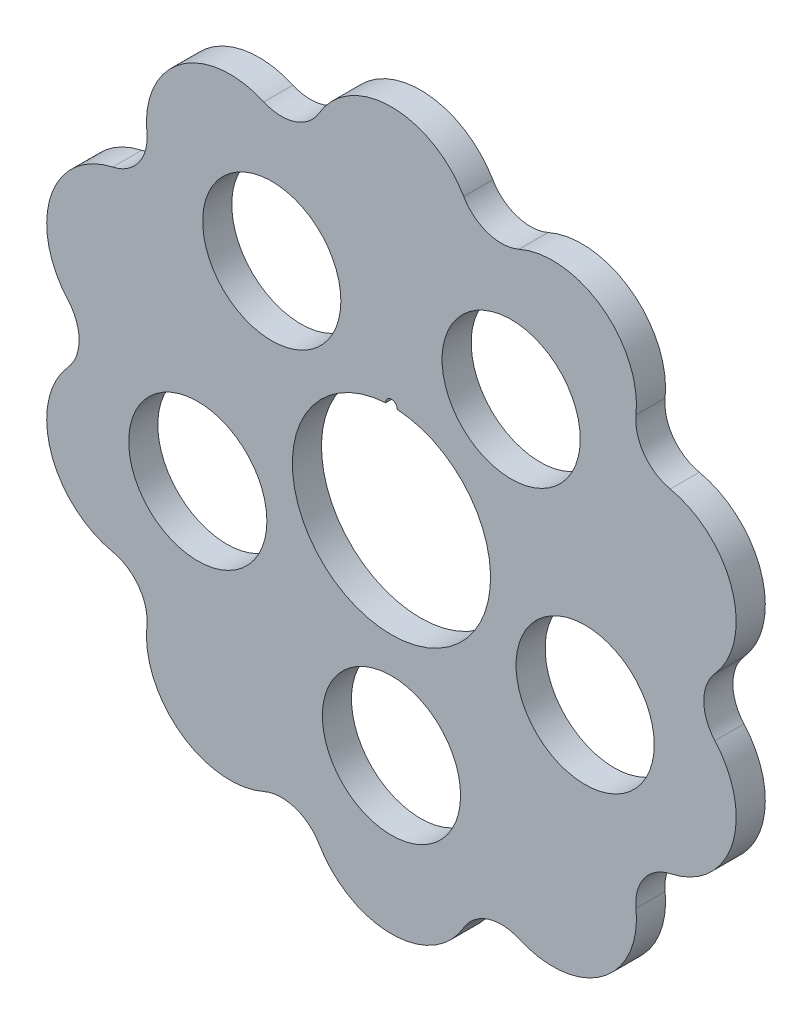
ISO-10303-21;
HEADER;
FILE_DESCRIPTION(('STEP AP214'),'2;1');
FILE_NAME('part.step','',(''),(''),'','','');
FILE_SCHEMA(('AUTOMOTIVE_DESIGN { 1 0 10303 214 1 1 1 1 }'));
ENDSEC;
DATA;
#1=APPLICATION_CONTEXT('core data for automotive mechanical design processes');
#2=APPLICATION_PROTOCOL_DEFINITION('international standard','automotive_design',2000,#1);
#3=PRODUCT_CONTEXT('',#1,'mechanical');
#4=PRODUCT('Part','Part','',(#3));
#5=PRODUCT_RELATED_PRODUCT_CATEGORY('part','',(#4));
#6=PRODUCT_DEFINITION_FORMATION('','',#4);
#7=PRODUCT_DEFINITION_CONTEXT('part definition',#1,'design');
#8=PRODUCT_DEFINITION('design','',#6,#7);
#9=PRODUCT_DEFINITION_SHAPE('','',#8);
#10=(LENGTH_UNIT() NAMED_UNIT(*) SI_UNIT(.MILLI.,.METRE.));
#11=(NAMED_UNIT(*) PLANE_ANGLE_UNIT() SI_UNIT($,.RADIAN.));
#12=(NAMED_UNIT(*) SI_UNIT($,.STERADIAN.) SOLID_ANGLE_UNIT());
#13=UNCERTAINTY_MEASURE_WITH_UNIT(LENGTH_MEASURE(1.E-05),#10,'distance_accuracy_value','');
#14=(GEOMETRIC_REPRESENTATION_CONTEXT(3) GLOBAL_UNCERTAINTY_ASSIGNED_CONTEXT((#13)) GLOBAL_UNIT_ASSIGNED_CONTEXT((#10,
#11,#12)) REPRESENTATION_CONTEXT('',''));
#15=CARTESIAN_POINT('',(0.,0.,0.));
#16=DIRECTION('',(0.,0.,1.));
#17=DIRECTION('',(1.,0.,0.));
#18=AXIS2_PLACEMENT_3D('',#15,#16,#17);
#19=CARTESIAN_POINT('',(-7.56276661941296,-42.1508023200655,4.));
#20=DIRECTION('',(0.,0.,-1.));
#21=DIRECTION('',(-1.,0.,0.));
#22=AXIS2_PLACEMENT_3D('',#19,#20,#21);
#23=PLANE('',#22);
#24=CARTESIAN_POINT('',(-15.1255332388259,-46.5516046401309,4.));
#25=DIRECTION('',(0.,0.,-1.));
#26=DIRECTION('',(-1.,0.,0.));
#27=AXIS2_PLACEMENT_3D('',#24,#25,#26);
#28=CIRCLE('',#27,5.99999999999993);
#29=CARTESIAN_POINT('',(-17.547256679471,-41.0620458621391,4.));
#30=VERTEX_POINT('',#29);
#31=CARTESIAN_POINT('',(-9.93963612837118,-43.5339116206576,4.));
#32=VERTEX_POINT('',#31);
#33=EDGE_CURVE('E283',#30,#32,#28,.T.);
#34=ORIENTED_EDGE('',*,*,#33,.T.);
#35=CARTESIAN_POINT('',(0.,-37.75,4.));
#36=DIRECTION('',(0.,0.,1.));
#37=DIRECTION('',(1.,0.,0.));
#38=AXIS2_PLACEMENT_3D('',#35,#36,#37);
#39=CIRCLE('',#38,11.5);
#40=CARTESIAN_POINT('',(9.93963612837118,-43.5339116206576,4.));
#41=VERTEX_POINT('',#40);
#42=EDGE_CURVE('E140',#32,#41,#39,.T.);
#43=ORIENTED_EDGE('',*,*,#42,.T.);
#44=CARTESIAN_POINT('',(15.1255332388256,-46.551604640131,4.));
#45=DIRECTION('',(0.,0.,-1.));
#46=DIRECTION('',(-1.,0.,0.));
#47=AXIS2_PLACEMENT_3D('',#44,#45,#46);
#48=CIRCLE('',#47,5.9999999999998);
#49=CARTESIAN_POINT('',(17.5472566794708,-41.0620458621392,4.));
#50=VERTEX_POINT('',#49);
#51=EDGE_CURVE('E388',#41,#50,#48,.T.);
#52=ORIENTED_EDGE('',*,*,#51,.T.);
#53=CARTESIAN_POINT('',(22.1888932740405,-30.5403915376545,4.));
#54=DIRECTION('',(0.,0.,1.));
#55=DIRECTION('',(1.,0.,0.));
#56=AXIS2_PLACEMENT_3D('',#53,#54,#55);
#57=CIRCLE('',#56,11.4999999999999);
#58=CARTESIAN_POINT('',(33.6299257709815,-29.3773028033194,4.));
#59=VERTEX_POINT('',#58);
#60=EDGE_CURVE('E391',#50,#59,#57,.T.);
#61=ORIENTED_EDGE('',*,*,#60,.T.);
#62=CARTESIAN_POINT('',(39.5991601172115,-28.7704738984489,4.));
#63=DIRECTION('',(0.,0.,-1.));
#64=DIRECTION('',(-1.,0.,0.));
#65=AXIS2_PLACEMENT_3D('',#62,#63,#64);
#66=CIRCLE('',#65,5.99999999999993);
#67=CARTESIAN_POINT('',(38.3316938450736,-22.9058742318909,4.));
#68=VERTEX_POINT('',#67);
#69=EDGE_CURVE('E394',#59,#68,#66,.T.);
#70=ORIENTED_EDGE('',*,*,#69,.T.);
#71=CARTESIAN_POINT('',(35.9023834901419,-11.6653915376547,4.));
#72=DIRECTION('',(0.,0.,1.));
#73=DIRECTION('',(1.,0.,0.));
#74=AXIS2_PLACEMENT_3D('',#71,#72,#73);
#75=CIRCLE('',#74,11.5);
#76=CARTESIAN_POINT('',(44.4747268082136,-3.99956281291058,4.));
#77=VERTEX_POINT('',#76);
#78=EDGE_CURVE('E397',#68,#77,#75,.T.);
#79=ORIENTED_EDGE('',*,*,#78,.T.);
#80=CARTESIAN_POINT('',(48.9472537567726,-7.11236625150491E-13,4.));
#81=DIRECTION('',(0.,0.,-1.));
#82=DIRECTION('',(-1.,0.,0.));
#83=AXIS2_PLACEMENT_3D('',#80,#81,#82);
#84=CIRCLE('',#83,5.99999999999993);
#85=CARTESIAN_POINT('',(44.4747268082138,3.99956281290956,4.));
#86=VERTEX_POINT('',#85);
#87=EDGE_CURVE('E400',#77,#86,#84,.T.);
#88=ORIENTED_EDGE('',*,*,#87,.T.);
#89=CARTESIAN_POINT('',(35.9023834901422,11.6653915376539,4.));
#90=DIRECTION('',(0.,0.,1.));
#91=DIRECTION('',(1.,0.,0.));
#92=AXIS2_PLACEMENT_3D('',#89,#90,#91);
#93=CIRCLE('',#92,11.5);
#94=CARTESIAN_POINT('',(38.3316938450741,22.90587423189,4.));
#95=VERTEX_POINT('',#94);
#96=EDGE_CURVE('E403',#86,#95,#93,.T.);
#97=ORIENTED_EDGE('',*,*,#96,.T.);
#98=CARTESIAN_POINT('',(39.5991601172124,28.7704738984478,4.));
#99=DIRECTION('',(0.,0.,-1.));
#100=DIRECTION('',(-1.,0.,0.));
#101=AXIS2_PLACEMENT_3D('',#98,#99,#100);
#102=CIRCLE('',#101,5.99999999999992);
#103=CARTESIAN_POINT('',(33.6299257709823,29.3773028033187,4.));
#104=VERTEX_POINT('',#103);
#105=EDGE_CURVE('E406',#95,#104,#102,.T.);
#106=ORIENTED_EDGE('',*,*,#105,.T.);
#107=CARTESIAN_POINT('',(22.1888932740411,30.5403915376541,4.));
#108=DIRECTION('',(0.,0.,1.));
#109=DIRECTION('',(1.,0.,0.));
#110=AXIS2_PLACEMENT_3D('',#107,#108,#109);
#111=CIRCLE('',#110,11.5);
#112=CARTESIAN_POINT('',(17.5472566794713,41.0620458621389,4.));
#113=VERTEX_POINT('',#112);
#114=EDGE_CURVE('E409',#104,#113,#111,.T.);
#115=ORIENTED_EDGE('',*,*,#114,.T.);
#116=CARTESIAN_POINT('',(15.1255332388263,46.5516046401308,4.));
#117=DIRECTION('',(0.,0.,-1.));
#118=DIRECTION('',(-1.,0.,0.));
#119=AXIS2_PLACEMENT_3D('',#116,#117,#118);
#120=CIRCLE('',#119,5.99999999999993);
#121=CARTESIAN_POINT('',(9.9396361283716,43.5339116206576,4.));
#122=VERTEX_POINT('',#121);
#123=EDGE_CURVE('E412',#113,#122,#120,.T.);
#124=ORIENTED_EDGE('',*,*,#123,.T.);
#125=CARTESIAN_POINT('',(2.63606841082657E-13,37.75,4.));
#126=DIRECTION('',(0.,0.,1.));
#127=DIRECTION('',(1.,0.,0.));
#128=AXIS2_PLACEMENT_3D('',#125,#126,#127);
#129=CIRCLE('',#128,11.5);
#130=CARTESIAN_POINT('',(-9.93963612837088,43.5339116206577,4.));
#131=VERTEX_POINT('',#130);
#132=EDGE_CURVE('E415',#122,#131,#129,.T.);
#133=ORIENTED_EDGE('',*,*,#132,.T.);
#134=CARTESIAN_POINT('',(-15.1255332388252,46.5516046401311,4.));
#135=DIRECTION('',(0.,0.,-1.));
#136=DIRECTION('',(-1.,0.,0.));
#137=AXIS2_PLACEMENT_3D('',#134,#135,#136);
#138=CIRCLE('',#137,5.99999999999992);
#139=CARTESIAN_POINT('',(-17.5472566794707,41.0620458621393,4.));
#140=VERTEX_POINT('',#139);
#141=EDGE_CURVE('E418',#131,#140,#138,.T.);
#142=ORIENTED_EDGE('',*,*,#141,.T.);
#143=CARTESIAN_POINT('',(-22.1888932740407,30.5403915376544,4.));
#144=DIRECTION('',(0.,0.,1.));
#145=DIRECTION('',(1.,0.,0.));
#146=AXIS2_PLACEMENT_3D('',#143,#144,#145);
#147=CIRCLE('',#146,11.5);
#148=CARTESIAN_POINT('',(-33.6299257709818,29.3773028033192,4.));
#149=VERTEX_POINT('',#148);
#150=EDGE_CURVE('E421',#140,#149,#147,.T.);
#151=ORIENTED_EDGE('',*,*,#150,.T.);
#152=CARTESIAN_POINT('',(-39.5991601172117,28.7704738984486,4.));
#153=DIRECTION('',(0.,0.,-1.));
#154=DIRECTION('',(-1.,0.,0.));
#155=AXIS2_PLACEMENT_3D('',#152,#153,#154);
#156=CIRCLE('',#155,5.99999999999992);
#157=CARTESIAN_POINT('',(-38.3316938450738,22.9058742318907,4.));
#158=VERTEX_POINT('',#157);
#159=EDGE_CURVE('E424',#149,#158,#156,.T.);
#160=ORIENTED_EDGE('',*,*,#159,.T.);
#161=CARTESIAN_POINT('',(-35.902383490142,11.6653915376544,4.));
#162=DIRECTION('',(0.,0.,1.));
#163=DIRECTION('',(1.,0.,0.));
#164=AXIS2_PLACEMENT_3D('',#161,#162,#163);
#165=CIRCLE('',#164,11.5);
#166=CARTESIAN_POINT('',(-44.4747268082136,3.99956281291027,4.));
#167=VERTEX_POINT('',#166);
#168=EDGE_CURVE('E427',#158,#167,#165,.T.);
#169=ORIENTED_EDGE('',*,*,#168,.T.);
#170=CARTESIAN_POINT('',(-48.9472537567726,3.66026653431106E-13,4.));
#171=DIRECTION('',(0.,0.,-1.));
#172=DIRECTION('',(-1.,0.,0.));
#173=AXIS2_PLACEMENT_3D('',#170,#171,#172);
#174=CIRCLE('',#173,5.99999999999992);
#175=CARTESIAN_POINT('',(-44.4747268082138,-3.99956281290986,4.));
#176=VERTEX_POINT('',#175);
#177=EDGE_CURVE('E198',#167,#176,#174,.T.);
#178=ORIENTED_EDGE('',*,*,#177,.T.);
#179=CARTESIAN_POINT('',(-35.9023834901421,-11.6653915376542,4.));
#180=DIRECTION('',(0.,0.,1.));
#181=DIRECTION('',(1.,0.,0.));
#182=AXIS2_PLACEMENT_3D('',#179,#180,#181);
#183=CIRCLE('',#182,11.5);
#184=CARTESIAN_POINT('',(-38.3316938450739,-22.9058742318903,4.));
#185=VERTEX_POINT('',#184);
#186=EDGE_CURVE('E191',#176,#185,#183,.T.);
#187=ORIENTED_EDGE('',*,*,#186,.T.);
#188=CARTESIAN_POINT('',(-39.5991601172122,-28.770473898448,4.));
#189=DIRECTION('',(0.,0.,-1.));
#190=DIRECTION('',(-1.,0.,0.));
#191=AXIS2_PLACEMENT_3D('',#188,#189,#190);
#192=CIRCLE('',#191,5.99999999999993);
#193=CARTESIAN_POINT('',(-33.6299257709821,-29.3773028033189,4.));
#194=VERTEX_POINT('',#193);
#195=EDGE_CURVE('E195',#185,#194,#192,.T.);
#196=ORIENTED_EDGE('',*,*,#195,.T.);
#197=CARTESIAN_POINT('',(-22.1888932740409,-30.5403915376542,4.));
#198=DIRECTION('',(0.,0.,1.));
#199=DIRECTION('',(1.,0.,0.));
#200=AXIS2_PLACEMENT_3D('',#197,#198,#199);
#201=CIRCLE('',#200,11.5);
#202=EDGE_CURVE('E62',#194,#30,#201,.T.);
#203=ORIENTED_EDGE('',*,*,#202,.T.);
#204=EDGE_LOOP('',(#34,#43,#52,#61,#70,#79,#88,#97,#106,#115,#124,#133,#142,#151,#160,#169,#178,
#187,#196,#203));
#205=FACE_BOUND('',#204,.T.);
#206=CARTESIAN_POINT('',(0.,0.,4.));
#207=DIRECTION('',(0.,0.,1.));
#208=DIRECTION('',(1.,0.,0.));
#209=AXIS2_PLACEMENT_3D('',#206,#207,#208);
#210=CIRCLE('',#209,13.625);
#211=CARTESIAN_POINT('',(-0.799655173558962,13.6015137614679,4.));
#212=VERTEX_POINT('',#211);
#213=CARTESIAN_POINT('',(0.799655173558962,13.6015137614679,4.));
#214=VERTEX_POINT('',#213);
#215=EDGE_CURVE('E228',#212,#214,#210,.T.);
#216=ORIENTED_EDGE('',*,*,#215,.F.);
#217=CARTESIAN_POINT('',(0.,13.625,4.));
#218=DIRECTION('',(0.,0.,1.));
#219=DIRECTION('',(1.,0.,0.));
#220=AXIS2_PLACEMENT_3D('',#217,#218,#219);
#221=CIRCLE('',#220,0.8);
#222=EDGE_CURVE('E53',#214,#212,#221,.T.);
#223=ORIENTED_EDGE('',*,*,#222,.F.);
#224=EDGE_LOOP('',(#216,#223));
#225=FACE_BOUND('',#224,.T.);
#226=CARTESIAN_POINT('',(0.,-28.,4.));
#227=DIRECTION('',(0.,0.,1.));
#228=DIRECTION('',(1.,0.,0.));
#229=AXIS2_PLACEMENT_3D('',#226,#227,#228);
#230=CIRCLE('',#229,9.5);
#231=CARTESIAN_POINT('',(9.5,-28.,4.));
#232=VERTEX_POINT('',#231);
#233=EDGE_CURVE('E374',#232,#232,#230,.T.);
#234=ORIENTED_EDGE('',*,*,#233,.F.);
#235=EDGE_LOOP('',(#234));
#236=FACE_BOUND('',#235,.T.);
#237=CARTESIAN_POINT('',(-26.6295824562643,-8.65247584249845,4.));
#238=DIRECTION('',(0.,0.,1.));
#239=DIRECTION('',(1.,0.,0.));
#240=AXIS2_PLACEMENT_3D('',#237,#238,#239);
#241=CIRCLE('',#240,9.5);
#242=CARTESIAN_POINT('',(-17.1295824562643,-8.65247584249845,4.));
#243=VERTEX_POINT('',#242);
#244=EDGE_CURVE('E646',#243,#243,#241,.T.);
#245=ORIENTED_EDGE('',*,*,#244,.F.);
#246=EDGE_LOOP('',(#245));
#247=FACE_BOUND('',#246,.T.);
#248=CARTESIAN_POINT('',(-16.4579870641891,22.6524758424986,4.));
#249=DIRECTION('',(0.,0.,1.));
#250=DIRECTION('',(1.,0.,0.));
#251=AXIS2_PLACEMENT_3D('',#248,#249,#250);
#252=CIRCLE('',#251,9.5);
#253=CARTESIAN_POINT('',(-6.95798706418912,22.6524758424986,4.));
#254=VERTEX_POINT('',#253);
#255=EDGE_CURVE('E638',#254,#254,#252,.T.);
#256=ORIENTED_EDGE('',*,*,#255,.F.);
#257=EDGE_LOOP('',(#256));
#258=FACE_BOUND('',#257,.T.);
#259=CARTESIAN_POINT('',(16.4579870641894,22.6524758424984,4.));
#260=DIRECTION('',(0.,0.,1.));
#261=DIRECTION('',(1.,0.,0.));
#262=AXIS2_PLACEMENT_3D('',#259,#260,#261);
#263=CIRCLE('',#262,9.5);
#264=CARTESIAN_POINT('',(25.9579870641894,22.6524758424984,4.));
#265=VERTEX_POINT('',#264);
#266=EDGE_CURVE('E630',#265,#265,#263,.T.);
#267=ORIENTED_EDGE('',*,*,#266,.F.);
#268=EDGE_LOOP('',(#267));
#269=FACE_BOUND('',#268,.T.);
#270=CARTESIAN_POINT('',(26.6295824562642,-8.65247584249883,4.));
#271=DIRECTION('',(0.,0.,1.));
#272=DIRECTION('',(1.,0.,0.));
#273=AXIS2_PLACEMENT_3D('',#270,#271,#272);
#274=CIRCLE('',#273,9.5);
#275=CARTESIAN_POINT('',(36.1295824562642,-8.65247584249883,4.));
#276=VERTEX_POINT('',#275);
#277=EDGE_CURVE('E620',#276,#276,#274,.T.);
#278=ORIENTED_EDGE('',*,*,#277,.F.);
#279=EDGE_LOOP('',(#278));
#280=FACE_BOUND('',#279,.T.);
#281=ADVANCED_FACE('F38',(#205,#225,#236,#247,#258,#269,#280),#23,.F.);
#282=CARTESIAN_POINT('',(-7.56276661941296,-42.1508023200655,0.));
#283=DIRECTION('',(0.,0.,-1.));
#284=DIRECTION('',(-1.,0.,0.));
#285=AXIS2_PLACEMENT_3D('',#282,#283,#284);
#286=PLANE('',#285);
#287=CARTESIAN_POINT('',(0.,13.625,0.));
#288=DIRECTION('',(0.,0.,-1.));
#289=DIRECTION('',(-1.,0.,0.));
#290=AXIS2_PLACEMENT_3D('',#287,#288,#289);
#291=CIRCLE('',#290,0.8);
#292=CARTESIAN_POINT('',(-0.799655173558961,13.6015137614679,0.));
#293=VERTEX_POINT('',#292);
#294=CARTESIAN_POINT('',(0.799655173558962,13.6015137614679,0.));
#295=VERTEX_POINT('',#294);
#296=EDGE_CURVE('E357',#293,#295,#291,.T.);
#297=ORIENTED_EDGE('',*,*,#296,.F.);
#298=CARTESIAN_POINT('',(0.,0.,0.));
#299=DIRECTION('',(0.,0.,1.));
#300=DIRECTION('',(1.,0.,0.));
#301=AXIS2_PLACEMENT_3D('',#298,#299,#300);
#302=CIRCLE('',#301,13.625);
#303=EDGE_CURVE('E368',#293,#295,#302,.T.);
#304=ORIENTED_EDGE('',*,*,#303,.T.);
#305=EDGE_LOOP('',(#297,#304));
#306=FACE_BOUND('',#305,.T.);
#307=CARTESIAN_POINT('',(16.4579870641894,22.6524758424984,0.));
#308=DIRECTION('',(0.,0.,1.));
#309=DIRECTION('',(1.,0.,0.));
#310=AXIS2_PLACEMENT_3D('',#307,#308,#309);
#311=CIRCLE('',#310,9.5);
#312=CARTESIAN_POINT('',(25.9579870641894,22.6524758424984,0.));
#313=VERTEX_POINT('',#312);
#314=EDGE_CURVE('E627',#313,#313,#311,.T.);
#315=ORIENTED_EDGE('',*,*,#314,.T.);
#316=EDGE_LOOP('',(#315));
#317=FACE_BOUND('',#316,.T.);
#318=CARTESIAN_POINT('',(-26.6295824562643,-8.65247584249845,0.));
#319=DIRECTION('',(0.,0.,1.));
#320=DIRECTION('',(1.,0.,0.));
#321=AXIS2_PLACEMENT_3D('',#318,#319,#320);
#322=CIRCLE('',#321,9.5);
#323=CARTESIAN_POINT('',(-17.1295824562643,-8.65247584249845,0.));
#324=VERTEX_POINT('',#323);
#325=EDGE_CURVE('E642',#324,#324,#322,.T.);
#326=ORIENTED_EDGE('',*,*,#325,.T.);
#327=EDGE_LOOP('',(#326));
#328=FACE_BOUND('',#327,.T.);
#329=CARTESIAN_POINT('',(-15.1255332388259,-46.5516046401309,0.));
#330=DIRECTION('',(0.,0.,-1.));
#331=DIRECTION('',(-1.,0.,0.));
#332=AXIS2_PLACEMENT_3D('',#329,#330,#331);
#333=CIRCLE('',#332,5.99999999999993);
#334=CARTESIAN_POINT('',(-17.547256679471,-41.0620458621391,0.));
#335=VERTEX_POINT('',#334);
#336=CARTESIAN_POINT('',(-9.93963612837118,-43.5339116206576,0.));
#337=VERTEX_POINT('',#336);
#338=EDGE_CURVE('E223',#335,#337,#333,.T.);
#339=ORIENTED_EDGE('',*,*,#338,.F.);
#340=CARTESIAN_POINT('',(-22.1888932740409,-30.5403915376542,0.));
#341=DIRECTION('',(0.,0.,1.));
#342=DIRECTION('',(1.,0.,0.));
#343=AXIS2_PLACEMENT_3D('',#340,#341,#342);
#344=CIRCLE('',#343,11.5);
#345=CARTESIAN_POINT('',(-33.6299257709821,-29.3773028033189,0.));
#346=VERTEX_POINT('',#345);
#347=EDGE_CURVE('E131',#346,#335,#344,.T.);
#348=ORIENTED_EDGE('',*,*,#347,.F.);
#349=CARTESIAN_POINT('',(-39.5991601172122,-28.770473898448,0.));
#350=DIRECTION('',(0.,0.,-1.));
#351=DIRECTION('',(-1.,0.,0.));
#352=AXIS2_PLACEMENT_3D('',#349,#350,#351);
#353=CIRCLE('',#352,5.99999999999993);
#354=CARTESIAN_POINT('',(-38.3316938450739,-22.9058742318903,0.));
#355=VERTEX_POINT('',#354);
#356=EDGE_CURVE('E278',#355,#346,#353,.T.);
#357=ORIENTED_EDGE('',*,*,#356,.F.);
#358=CARTESIAN_POINT('',(-35.9023834901421,-11.6653915376542,0.));
#359=DIRECTION('',(0.,0.,1.));
#360=DIRECTION('',(1.,0.,0.));
#361=AXIS2_PLACEMENT_3D('',#358,#359,#360);
#362=CIRCLE('',#361,11.5);
#363=CARTESIAN_POINT('',(-44.4747268082138,-3.99956281290986,0.));
#364=VERTEX_POINT('',#363);
#365=EDGE_CURVE('E208',#364,#355,#362,.T.);
#366=ORIENTED_EDGE('',*,*,#365,.F.);
#367=CARTESIAN_POINT('',(-48.9472537567726,3.66026653431106E-13,0.));
#368=DIRECTION('',(0.,0.,-1.));
#369=DIRECTION('',(-1.,0.,0.));
#370=AXIS2_PLACEMENT_3D('',#367,#368,#369);
#371=CIRCLE('',#370,5.99999999999992);
#372=CARTESIAN_POINT('',(-44.4747268082136,3.99956281291027,0.));
#373=VERTEX_POINT('',#372);
#374=EDGE_CURVE('E273',#373,#364,#371,.T.);
#375=ORIENTED_EDGE('',*,*,#374,.F.);
#376=CARTESIAN_POINT('',(-35.902383490142,11.6653915376544,0.));
#377=DIRECTION('',(0.,0.,1.));
#378=DIRECTION('',(1.,0.,0.));
#379=AXIS2_PLACEMENT_3D('',#376,#377,#378);
#380=CIRCLE('',#379,11.5);
#381=CARTESIAN_POINT('',(-38.3316938450738,22.9058742318907,0.));
#382=VERTEX_POINT('',#381);
#383=EDGE_CURVE('E270',#382,#373,#380,.T.);
#384=ORIENTED_EDGE('',*,*,#383,.F.);
#385=CARTESIAN_POINT('',(-39.5991601172117,28.7704738984486,0.));
#386=DIRECTION('',(0.,0.,-1.));
#387=DIRECTION('',(-1.,0.,0.));
#388=AXIS2_PLACEMENT_3D('',#385,#386,#387);
#389=CIRCLE('',#388,5.99999999999992);
#390=CARTESIAN_POINT('',(-33.6299257709818,29.3773028033192,0.));
#391=VERTEX_POINT('',#390);
#392=EDGE_CURVE('E267',#391,#382,#389,.T.);
#393=ORIENTED_EDGE('',*,*,#392,.F.);
#394=CARTESIAN_POINT('',(-22.1888932740407,30.5403915376544,0.));
#395=DIRECTION('',(0.,0.,1.));
#396=DIRECTION('',(1.,0.,0.));
#397=AXIS2_PLACEMENT_3D('',#394,#395,#396);
#398=CIRCLE('',#397,11.5);
#399=CARTESIAN_POINT('',(-17.5472566794707,41.0620458621393,0.));
#400=VERTEX_POINT('',#399);
#401=EDGE_CURVE('E264',#400,#391,#398,.T.);
#402=ORIENTED_EDGE('',*,*,#401,.F.);
#403=CARTESIAN_POINT('',(-15.1255332388252,46.5516046401311,0.));
#404=DIRECTION('',(0.,0.,-1.));
#405=DIRECTION('',(-1.,0.,0.));
#406=AXIS2_PLACEMENT_3D('',#403,#404,#405);
#407=CIRCLE('',#406,5.99999999999992);
#408=CARTESIAN_POINT('',(-9.93963612837088,43.5339116206577,0.));
#409=VERTEX_POINT('',#408);
#410=EDGE_CURVE('E261',#409,#400,#407,.T.);
#411=ORIENTED_EDGE('',*,*,#410,.F.);
#412=CARTESIAN_POINT('',(2.63606841082657E-13,37.75,0.));
#413=DIRECTION('',(0.,0.,1.));
#414=DIRECTION('',(1.,0.,0.));
#415=AXIS2_PLACEMENT_3D('',#412,#413,#414);
#416=CIRCLE('',#415,11.5);
#417=CARTESIAN_POINT('',(9.9396361283716,43.5339116206576,0.));
#418=VERTEX_POINT('',#417);
#419=EDGE_CURVE('E258',#418,#409,#416,.T.);
#420=ORIENTED_EDGE('',*,*,#419,.F.);
#421=CARTESIAN_POINT('',(15.1255332388263,46.5516046401308,0.));
#422=DIRECTION('',(0.,0.,-1.));
#423=DIRECTION('',(-1.,0.,0.));
#424=AXIS2_PLACEMENT_3D('',#421,#422,#423);
#425=CIRCLE('',#424,5.99999999999993);
#426=CARTESIAN_POINT('',(17.5472566794713,41.0620458621389,0.));
#427=VERTEX_POINT('',#426);
#428=EDGE_CURVE('E255',#427,#418,#425,.T.);
#429=ORIENTED_EDGE('',*,*,#428,.F.);
#430=CARTESIAN_POINT('',(22.1888932740411,30.5403915376541,0.));
#431=DIRECTION('',(0.,0.,1.));
#432=DIRECTION('',(1.,0.,0.));
#433=AXIS2_PLACEMENT_3D('',#430,#431,#432);
#434=CIRCLE('',#433,11.5);
#435=CARTESIAN_POINT('',(33.6299257709823,29.3773028033187,0.));
#436=VERTEX_POINT('',#435);
#437=EDGE_CURVE('E252',#436,#427,#434,.T.);
#438=ORIENTED_EDGE('',*,*,#437,.F.);
#439=CARTESIAN_POINT('',(39.5991601172124,28.7704738984478,0.));
#440=DIRECTION('',(0.,0.,-1.));
#441=DIRECTION('',(-1.,0.,0.));
#442=AXIS2_PLACEMENT_3D('',#439,#440,#441);
#443=CIRCLE('',#442,5.99999999999992);
#444=CARTESIAN_POINT('',(38.3316938450741,22.90587423189,0.));
#445=VERTEX_POINT('',#444);
#446=EDGE_CURVE('E249',#445,#436,#443,.T.);
#447=ORIENTED_EDGE('',*,*,#446,.F.);
#448=CARTESIAN_POINT('',(35.9023834901422,11.6653915376539,0.));
#449=DIRECTION('',(0.,0.,1.));
#450=DIRECTION('',(1.,0.,0.));
#451=AXIS2_PLACEMENT_3D('',#448,#449,#450);
#452=CIRCLE('',#451,11.5);
#453=CARTESIAN_POINT('',(44.4747268082138,3.99956281290956,0.));
#454=VERTEX_POINT('',#453);
#455=EDGE_CURVE('E246',#454,#445,#452,.T.);
#456=ORIENTED_EDGE('',*,*,#455,.F.);
#457=CARTESIAN_POINT('',(48.9472537567726,-7.11236625150491E-13,0.));
#458=DIRECTION('',(0.,0.,-1.));
#459=DIRECTION('',(-1.,0.,0.));
#460=AXIS2_PLACEMENT_3D('',#457,#458,#459);
#461=CIRCLE('',#460,5.99999999999993);
#462=CARTESIAN_POINT('',(44.4747268082136,-3.99956281291058,0.));
#463=VERTEX_POINT('',#462);
#464=EDGE_CURVE('E243',#463,#454,#461,.T.);
#465=ORIENTED_EDGE('',*,*,#464,.F.);
#466=CARTESIAN_POINT('',(35.9023834901419,-11.6653915376547,0.));
#467=DIRECTION('',(0.,0.,1.));
#468=DIRECTION('',(1.,0.,0.));
#469=AXIS2_PLACEMENT_3D('',#466,#467,#468);
#470=CIRCLE('',#469,11.5);
#471=CARTESIAN_POINT('',(38.3316938450736,-22.9058742318909,0.));
#472=VERTEX_POINT('',#471);
#473=EDGE_CURVE('E240',#472,#463,#470,.T.);
#474=ORIENTED_EDGE('',*,*,#473,.F.);
#475=CARTESIAN_POINT('',(39.5991601172115,-28.7704738984489,0.));
#476=DIRECTION('',(0.,0.,-1.));
#477=DIRECTION('',(-1.,0.,0.));
#478=AXIS2_PLACEMENT_3D('',#475,#476,#477);
#479=CIRCLE('',#478,5.99999999999993);
#480=CARTESIAN_POINT('',(33.6299257709815,-29.3773028033194,0.));
#481=VERTEX_POINT('',#480);
#482=EDGE_CURVE('E237',#481,#472,#479,.T.);
#483=ORIENTED_EDGE('',*,*,#482,.F.);
#484=CARTESIAN_POINT('',(22.1888932740405,-30.5403915376545,0.));
#485=DIRECTION('',(0.,0.,1.));
#486=DIRECTION('',(1.,0.,0.));
#487=AXIS2_PLACEMENT_3D('',#484,#485,#486);
#488=CIRCLE('',#487,11.4999999999999);
#489=CARTESIAN_POINT('',(17.5472566794708,-41.0620458621392,0.));
#490=VERTEX_POINT('',#489);
#491=EDGE_CURVE('E234',#490,#481,#488,.T.);
#492=ORIENTED_EDGE('',*,*,#491,.F.);
#493=CARTESIAN_POINT('',(15.1255332388256,-46.551604640131,0.));
#494=DIRECTION('',(0.,0.,-1.));
#495=DIRECTION('',(-1.,0.,0.));
#496=AXIS2_PLACEMENT_3D('',#493,#494,#495);
#497=CIRCLE('',#496,5.9999999999998);
#498=CARTESIAN_POINT('',(9.93963612837118,-43.5339116206576,0.));
#499=VERTEX_POINT('',#498);
#500=EDGE_CURVE('E231',#499,#490,#497,.T.);
#501=ORIENTED_EDGE('',*,*,#500,.F.);
#502=CARTESIAN_POINT('',(0.,-37.75,0.));
#503=DIRECTION('',(0.,0.,1.));
#504=DIRECTION('',(1.,0.,0.));
#505=AXIS2_PLACEMENT_3D('',#502,#503,#504);
#506=CIRCLE('',#505,11.5);
#507=EDGE_CURVE('E227',#337,#499,#506,.T.);
#508=ORIENTED_EDGE('',*,*,#507,.F.);
#509=EDGE_LOOP('',(#339,#348,#357,#366,#375,#384,#393,#402,#411,#420,#429,#438,#447,#456,#465,
#474,#483,#492,#501,#508));
#510=FACE_BOUND('',#509,.T.);
#511=CARTESIAN_POINT('',(0.,-28.,0.));
#512=DIRECTION('',(0.,0.,1.));
#513=DIRECTION('',(1.,0.,0.));
#514=AXIS2_PLACEMENT_3D('',#511,#512,#513);
#515=CIRCLE('',#514,9.5);
#516=CARTESIAN_POINT('',(9.5,-28.,0.));
#517=VERTEX_POINT('',#516);
#518=EDGE_CURVE('E380',#517,#517,#515,.T.);
#519=ORIENTED_EDGE('',*,*,#518,.T.);
#520=EDGE_LOOP('',(#519));
#521=FACE_BOUND('',#520,.T.);
#522=CARTESIAN_POINT('',(-16.4579870641891,22.6524758424986,0.));
#523=DIRECTION('',(0.,0.,1.));
#524=DIRECTION('',(1.,0.,0.));
#525=AXIS2_PLACEMENT_3D('',#522,#523,#524);
#526=CIRCLE('',#525,9.5);
#527=CARTESIAN_POINT('',(-6.95798706418912,22.6524758424986,0.));
#528=VERTEX_POINT('',#527);
#529=EDGE_CURVE('E634',#528,#528,#526,.T.);
#530=ORIENTED_EDGE('',*,*,#529,.T.);
#531=EDGE_LOOP('',(#530));
#532=FACE_BOUND('',#531,.T.);
#533=CARTESIAN_POINT('',(26.6295824562642,-8.65247584249883,0.));
#534=DIRECTION('',(0.,0.,1.));
#535=DIRECTION('',(1.,0.,0.));
#536=AXIS2_PLACEMENT_3D('',#533,#534,#535);
#537=CIRCLE('',#536,9.5);
#538=CARTESIAN_POINT('',(36.1295824562642,-8.65247584249883,0.));
#539=VERTEX_POINT('',#538);
#540=EDGE_CURVE('E370',#539,#539,#537,.T.);
#541=ORIENTED_EDGE('',*,*,#540,.T.);
#542=EDGE_LOOP('',(#541));
#543=FACE_BOUND('',#542,.T.);
#544=ADVANCED_FACE('F366',(#306,#317,#328,#510,#521,#532,#543),#286,.T.);
#545=CARTESIAN_POINT('',(-15.1255332388259,-46.5516046401309,4.));
#546=DIRECTION('',(0.,0.,-1.));
#547=DIRECTION('',(-1.,0.,0.));
#548=AXIS2_PLACEMENT_3D('',#545,#546,#547);
#549=CYLINDRICAL_SURFACE('',#548,5.99999999999993);
#550=ORIENTED_EDGE('',*,*,#338,.T.);
#551=DIRECTION('',(0.,0.,-1.));
#552=VECTOR('',#551,1.);
#553=CARTESIAN_POINT('',(-9.93963612837118,-43.5339116206576,4.));
#554=LINE('',#553,#552);
#555=EDGE_CURVE('E350',#32,#337,#554,.T.);
#556=ORIENTED_EDGE('',*,*,#555,.F.);
#557=ORIENTED_EDGE('',*,*,#33,.F.);
#558=DIRECTION('',(0.,0.,-1.));
#559=VECTOR('',#558,1.);
#560=CARTESIAN_POINT('',(-17.547256679471,-41.0620458621391,4.));
#561=LINE('',#560,#559);
#562=EDGE_CURVE('E219',#30,#335,#561,.T.);
#563=ORIENTED_EDGE('',*,*,#562,.T.);
#564=EDGE_LOOP('',(#550,#556,#557,#563));
#565=FACE_BOUND('',#564,.T.);
#566=ADVANCED_FACE('F40',(#565),#549,.F.);
#567=CARTESIAN_POINT('',(0.,-37.75,4.));
#568=DIRECTION('',(0.,0.,-1.));
#569=DIRECTION('',(-1.,0.,0.));
#570=AXIS2_PLACEMENT_3D('',#567,#568,#569);
#571=CYLINDRICAL_SURFACE('',#570,11.5);
#572=ORIENTED_EDGE('',*,*,#507,.T.);
#573=DIRECTION('',(0.,0.,-1.));
#574=VECTOR('',#573,1.);
#575=CARTESIAN_POINT('',(9.93963612837118,-43.5339116206576,4.));
#576=LINE('',#575,#574);
#577=EDGE_CURVE('E346',#41,#499,#576,.T.);
#578=ORIENTED_EDGE('',*,*,#577,.F.);
#579=ORIENTED_EDGE('',*,*,#42,.F.);
#580=ORIENTED_EDGE('',*,*,#555,.T.);
#581=EDGE_LOOP('',(#572,#578,#579,#580));
#582=FACE_BOUND('',#581,.T.);
#583=ADVANCED_FACE('F449',(#582),#571,.T.);
#584=CARTESIAN_POINT('',(15.1255332388256,-46.551604640131,4.));
#585=DIRECTION('',(0.,0.,-1.));
#586=DIRECTION('',(-1.,0.,0.));
#587=AXIS2_PLACEMENT_3D('',#584,#585,#586);
#588=CYLINDRICAL_SURFACE('',#587,5.9999999999998);
#589=ORIENTED_EDGE('',*,*,#500,.T.);
#590=DIRECTION('',(0.,0.,-1.));
#591=VECTOR('',#590,1.);
#592=CARTESIAN_POINT('',(17.5472566794708,-41.0620458621392,4.));
#593=LINE('',#592,#591);
#594=EDGE_CURVE('E342',#50,#490,#593,.T.);
#595=ORIENTED_EDGE('',*,*,#594,.F.);
#596=ORIENTED_EDGE('',*,*,#51,.F.);
#597=ORIENTED_EDGE('',*,*,#577,.T.);
#598=EDGE_LOOP('',(#589,#595,#596,#597));
#599=FACE_BOUND('',#598,.T.);
#600=ADVANCED_FACE('F452',(#599),#588,.F.);
#601=CARTESIAN_POINT('',(22.1888932740405,-30.5403915376545,4.));
#602=DIRECTION('',(0.,0.,-1.));
#603=DIRECTION('',(-1.,0.,0.));
#604=AXIS2_PLACEMENT_3D('',#601,#602,#603);
#605=CYLINDRICAL_SURFACE('',#604,11.4999999999999);
#606=ORIENTED_EDGE('',*,*,#491,.T.);
#607=DIRECTION('',(0.,0.,-1.));
#608=VECTOR('',#607,1.);
#609=CARTESIAN_POINT('',(33.6299257709815,-29.3773028033194,4.));
#610=LINE('',#609,#608);
#611=EDGE_CURVE('E338',#59,#481,#610,.T.);
#612=ORIENTED_EDGE('',*,*,#611,.F.);
#613=ORIENTED_EDGE('',*,*,#60,.F.);
#614=ORIENTED_EDGE('',*,*,#594,.T.);
#615=EDGE_LOOP('',(#606,#612,#613,#614));
#616=FACE_BOUND('',#615,.T.);
#617=ADVANCED_FACE('F457',(#616),#605,.T.);
#618=CARTESIAN_POINT('',(39.5991601172115,-28.7704738984489,4.));
#619=DIRECTION('',(0.,0.,-1.));
#620=DIRECTION('',(-1.,0.,0.));
#621=AXIS2_PLACEMENT_3D('',#618,#619,#620);
#622=CYLINDRICAL_SURFACE('',#621,5.99999999999993);
#623=ORIENTED_EDGE('',*,*,#482,.T.);
#624=DIRECTION('',(0.,0.,-1.));
#625=VECTOR('',#624,1.);
#626=CARTESIAN_POINT('',(38.3316938450736,-22.9058742318909,4.));
#627=LINE('',#626,#625);
#628=EDGE_CURVE('E334',#68,#472,#627,.T.);
#629=ORIENTED_EDGE('',*,*,#628,.F.);
#630=ORIENTED_EDGE('',*,*,#69,.F.);
#631=ORIENTED_EDGE('',*,*,#611,.T.);
#632=EDGE_LOOP('',(#623,#629,#630,#631));
#633=FACE_BOUND('',#632,.T.);
#634=ADVANCED_FACE('F463',(#633),#622,.F.);
#635=CARTESIAN_POINT('',(35.9023834901419,-11.6653915376547,4.));
#636=DIRECTION('',(0.,0.,-1.));
#637=DIRECTION('',(-1.,0.,0.));
#638=AXIS2_PLACEMENT_3D('',#635,#636,#637);
#639=CYLINDRICAL_SURFACE('',#638,11.5);
#640=ORIENTED_EDGE('',*,*,#473,.T.);
#641=DIRECTION('',(0.,0.,-1.));
#642=VECTOR('',#641,1.);
#643=CARTESIAN_POINT('',(44.4747268082136,-3.99956281291058,4.));
#644=LINE('',#643,#642);
#645=EDGE_CURVE('E330',#77,#463,#644,.T.);
#646=ORIENTED_EDGE('',*,*,#645,.F.);
#647=ORIENTED_EDGE('',*,*,#78,.F.);
#648=ORIENTED_EDGE('',*,*,#628,.T.);
#649=EDGE_LOOP('',(#640,#646,#647,#648));
#650=FACE_BOUND('',#649,.T.);
#651=ADVANCED_FACE('F467',(#650),#639,.T.);
#652=CARTESIAN_POINT('',(48.9472537567726,-7.11236625150491E-13,4.));
#653=DIRECTION('',(0.,0.,-1.));
#654=DIRECTION('',(-1.,0.,0.));
#655=AXIS2_PLACEMENT_3D('',#652,#653,#654);
#656=CYLINDRICAL_SURFACE('',#655,5.99999999999993);
#657=ORIENTED_EDGE('',*,*,#464,.T.);
#658=DIRECTION('',(0.,0.,-1.));
#659=VECTOR('',#658,1.);
#660=CARTESIAN_POINT('',(44.4747268082138,3.99956281290956,4.));
#661=LINE('',#660,#659);
#662=EDGE_CURVE('E326',#86,#454,#661,.T.);
#663=ORIENTED_EDGE('',*,*,#662,.F.);
#664=ORIENTED_EDGE('',*,*,#87,.F.);
#665=ORIENTED_EDGE('',*,*,#645,.T.);
#666=EDGE_LOOP('',(#657,#663,#664,#665));
#667=FACE_BOUND('',#666,.T.);
#668=ADVANCED_FACE('F472',(#667),#656,.F.);
#669=CARTESIAN_POINT('',(35.9023834901422,11.6653915376539,4.));
#670=DIRECTION('',(0.,0.,-1.));
#671=DIRECTION('',(-1.,0.,0.));
#672=AXIS2_PLACEMENT_3D('',#669,#670,#671);
#673=CYLINDRICAL_SURFACE('',#672,11.5);
#674=ORIENTED_EDGE('',*,*,#455,.T.);
#675=DIRECTION('',(0.,0.,-1.));
#676=VECTOR('',#675,1.);
#677=CARTESIAN_POINT('',(38.3316938450741,22.90587423189,4.));
#678=LINE('',#677,#676);
#679=EDGE_CURVE('E322',#95,#445,#678,.T.);
#680=ORIENTED_EDGE('',*,*,#679,.F.);
#681=ORIENTED_EDGE('',*,*,#96,.F.);
#682=ORIENTED_EDGE('',*,*,#662,.T.);
#683=EDGE_LOOP('',(#674,#680,#681,#682));
#684=FACE_BOUND('',#683,.T.);
#685=ADVANCED_FACE('F478',(#684),#673,.T.);
#686=CARTESIAN_POINT('',(39.5991601172124,28.7704738984478,4.));
#687=DIRECTION('',(0.,0.,-1.));
#688=DIRECTION('',(-1.,0.,0.));
#689=AXIS2_PLACEMENT_3D('',#686,#687,#688);
#690=CYLINDRICAL_SURFACE('',#689,5.99999999999992);
#691=ORIENTED_EDGE('',*,*,#446,.T.);
#692=DIRECTION('',(0.,0.,-1.));
#693=VECTOR('',#692,1.);
#694=CARTESIAN_POINT('',(33.6299257709823,29.3773028033187,4.));
#695=LINE('',#694,#693);
#696=EDGE_CURVE('E318',#104,#436,#695,.T.);
#697=ORIENTED_EDGE('',*,*,#696,.F.);
#698=ORIENTED_EDGE('',*,*,#105,.F.);
#699=ORIENTED_EDGE('',*,*,#679,.T.);
#700=EDGE_LOOP('',(#691,#697,#698,#699));
#701=FACE_BOUND('',#700,.T.);
#702=ADVANCED_FACE('F482',(#701),#690,.F.);
#703=CARTESIAN_POINT('',(22.1888932740411,30.5403915376541,4.));
#704=DIRECTION('',(0.,0.,-1.));
#705=DIRECTION('',(-1.,0.,0.));
#706=AXIS2_PLACEMENT_3D('',#703,#704,#705);
#707=CYLINDRICAL_SURFACE('',#706,11.5);
#708=ORIENTED_EDGE('',*,*,#437,.T.);
#709=DIRECTION('',(0.,0.,-1.));
#710=VECTOR('',#709,1.);
#711=CARTESIAN_POINT('',(17.5472566794713,41.0620458621389,4.));
#712=LINE('',#711,#710);
#713=EDGE_CURVE('E314',#113,#427,#712,.T.);
#714=ORIENTED_EDGE('',*,*,#713,.F.);
#715=ORIENTED_EDGE('',*,*,#114,.F.);
#716=ORIENTED_EDGE('',*,*,#696,.T.);
#717=EDGE_LOOP('',(#708,#714,#715,#716));
#718=FACE_BOUND('',#717,.T.);
#719=ADVANCED_FACE('F487',(#718),#707,.T.);
#720=CARTESIAN_POINT('',(15.1255332388263,46.5516046401308,4.));
#721=DIRECTION('',(0.,0.,-1.));
#722=DIRECTION('',(-1.,0.,0.));
#723=AXIS2_PLACEMENT_3D('',#720,#721,#722);
#724=CYLINDRICAL_SURFACE('',#723,5.99999999999993);
#725=ORIENTED_EDGE('',*,*,#428,.T.);
#726=DIRECTION('',(0.,0.,-1.));
#727=VECTOR('',#726,1.);
#728=CARTESIAN_POINT('',(9.9396361283716,43.5339116206576,4.));
#729=LINE('',#728,#727);
#730=EDGE_CURVE('E310',#122,#418,#729,.T.);
#731=ORIENTED_EDGE('',*,*,#730,.F.);
#732=ORIENTED_EDGE('',*,*,#123,.F.);
#733=ORIENTED_EDGE('',*,*,#713,.T.);
#734=EDGE_LOOP('',(#725,#731,#732,#733));
#735=FACE_BOUND('',#734,.T.);
#736=ADVANCED_FACE('F493',(#735),#724,.F.);
#737=CARTESIAN_POINT('',(2.63606841082657E-13,37.75,4.));
#738=DIRECTION('',(0.,0.,-1.));
#739=DIRECTION('',(-1.,0.,0.));
#740=AXIS2_PLACEMENT_3D('',#737,#738,#739);
#741=CYLINDRICAL_SURFACE('',#740,11.5);
#742=ORIENTED_EDGE('',*,*,#419,.T.);
#743=DIRECTION('',(0.,0.,-1.));
#744=VECTOR('',#743,1.);
#745=CARTESIAN_POINT('',(-9.93963612837088,43.5339116206577,4.));
#746=LINE('',#745,#744);
#747=EDGE_CURVE('E306',#131,#409,#746,.T.);
#748=ORIENTED_EDGE('',*,*,#747,.F.);
#749=ORIENTED_EDGE('',*,*,#132,.F.);
#750=ORIENTED_EDGE('',*,*,#730,.T.);
#751=EDGE_LOOP('',(#742,#748,#749,#750));
#752=FACE_BOUND('',#751,.T.);
#753=ADVANCED_FACE('F497',(#752),#741,.T.);
#754=CARTESIAN_POINT('',(-15.1255332388252,46.5516046401311,4.));
#755=DIRECTION('',(0.,0.,-1.));
#756=DIRECTION('',(-1.,0.,0.));
#757=AXIS2_PLACEMENT_3D('',#754,#755,#756);
#758=CYLINDRICAL_SURFACE('',#757,5.99999999999992);
#759=ORIENTED_EDGE('',*,*,#410,.T.);
#760=DIRECTION('',(0.,0.,-1.));
#761=VECTOR('',#760,1.);
#762=CARTESIAN_POINT('',(-17.5472566794707,41.0620458621393,4.));
#763=LINE('',#762,#761);
#764=EDGE_CURVE('E302',#140,#400,#763,.T.);
#765=ORIENTED_EDGE('',*,*,#764,.F.);
#766=ORIENTED_EDGE('',*,*,#141,.F.);
#767=ORIENTED_EDGE('',*,*,#747,.T.);
#768=EDGE_LOOP('',(#759,#765,#766,#767));
#769=FACE_BOUND('',#768,.T.);
#770=ADVANCED_FACE('F502',(#769),#758,.F.);
#771=CARTESIAN_POINT('',(-22.1888932740407,30.5403915376544,4.));
#772=DIRECTION('',(0.,0.,-1.));
#773=DIRECTION('',(-1.,0.,0.));
#774=AXIS2_PLACEMENT_3D('',#771,#772,#773);
#775=CYLINDRICAL_SURFACE('',#774,11.5);
#776=ORIENTED_EDGE('',*,*,#401,.T.);
#777=DIRECTION('',(0.,0.,-1.));
#778=VECTOR('',#777,1.);
#779=CARTESIAN_POINT('',(-33.6299257709818,29.3773028033192,4.));
#780=LINE('',#779,#778);
#781=EDGE_CURVE('E298',#149,#391,#780,.T.);
#782=ORIENTED_EDGE('',*,*,#781,.F.);
#783=ORIENTED_EDGE('',*,*,#150,.F.);
#784=ORIENTED_EDGE('',*,*,#764,.T.);
#785=EDGE_LOOP('',(#776,#782,#783,#784));
#786=FACE_BOUND('',#785,.T.);
#787=ADVANCED_FACE('F506',(#786),#775,.T.);
#788=CARTESIAN_POINT('',(-39.5991601172117,28.7704738984486,4.));
#789=DIRECTION('',(0.,0.,-1.));
#790=DIRECTION('',(-1.,0.,0.));
#791=AXIS2_PLACEMENT_3D('',#788,#789,#790);
#792=CYLINDRICAL_SURFACE('',#791,5.99999999999992);
#793=ORIENTED_EDGE('',*,*,#392,.T.);
#794=DIRECTION('',(0.,0.,-1.));
#795=VECTOR('',#794,1.);
#796=CARTESIAN_POINT('',(-38.3316938450738,22.9058742318907,4.));
#797=LINE('',#796,#795);
#798=EDGE_CURVE('E294',#158,#382,#797,.T.);
#799=ORIENTED_EDGE('',*,*,#798,.F.);
#800=ORIENTED_EDGE('',*,*,#159,.F.);
#801=ORIENTED_EDGE('',*,*,#781,.T.);
#802=EDGE_LOOP('',(#793,#799,#800,#801));
#803=FACE_BOUND('',#802,.T.);
#804=ADVANCED_FACE('F510',(#803),#792,.F.);
#805=CARTESIAN_POINT('',(-35.902383490142,11.6653915376544,4.));
#806=DIRECTION('',(0.,0.,-1.));
#807=DIRECTION('',(-1.,0.,0.));
#808=AXIS2_PLACEMENT_3D('',#805,#806,#807);
#809=CYLINDRICAL_SURFACE('',#808,11.5);
#810=ORIENTED_EDGE('',*,*,#383,.T.);
#811=DIRECTION('',(0.,0.,-1.));
#812=VECTOR('',#811,1.);
#813=CARTESIAN_POINT('',(-44.4747268082136,3.99956281291027,4.));
#814=LINE('',#813,#812);
#815=EDGE_CURVE('E290',#167,#373,#814,.T.);
#816=ORIENTED_EDGE('',*,*,#815,.F.);
#817=ORIENTED_EDGE('',*,*,#168,.F.);
#818=ORIENTED_EDGE('',*,*,#798,.T.);
#819=EDGE_LOOP('',(#810,#816,#817,#818));
#820=FACE_BOUND('',#819,.T.);
#821=ADVANCED_FACE('F435',(#820),#809,.T.);
#822=CARTESIAN_POINT('',(-48.9472537567726,3.66026653431106E-13,4.));
#823=DIRECTION('',(0.,0.,-1.));
#824=DIRECTION('',(-1.,0.,0.));
#825=AXIS2_PLACEMENT_3D('',#822,#823,#824);
#826=CYLINDRICAL_SURFACE('',#825,5.99999999999992);
#827=ORIENTED_EDGE('',*,*,#374,.T.);
#828=DIRECTION('',(0.,0.,-1.));
#829=VECTOR('',#828,1.);
#830=CARTESIAN_POINT('',(-44.4747268082138,-3.99956281290986,4.));
#831=LINE('',#830,#829);
#832=EDGE_CURVE('E212',#176,#364,#831,.T.);
#833=ORIENTED_EDGE('',*,*,#832,.F.);
#834=ORIENTED_EDGE('',*,*,#177,.F.);
#835=ORIENTED_EDGE('',*,*,#815,.T.);
#836=EDGE_LOOP('',(#827,#833,#834,#835));
#837=FACE_BOUND('',#836,.T.);
#838=ADVANCED_FACE('F439',(#837),#826,.F.);
#839=CARTESIAN_POINT('',(-35.9023834901421,-11.6653915376542,4.));
#840=DIRECTION('',(0.,0.,-1.));
#841=DIRECTION('',(-1.,0.,0.));
#842=AXIS2_PLACEMENT_3D('',#839,#840,#841);
#843=CYLINDRICAL_SURFACE('',#842,11.5);
#844=ORIENTED_EDGE('',*,*,#365,.T.);
#845=DIRECTION('',(0.,0.,-1.));
#846=VECTOR('',#845,1.);
#847=CARTESIAN_POINT('',(-38.3316938450739,-22.9058742318903,4.));
#848=LINE('',#847,#846);
#849=EDGE_CURVE('E205',#185,#355,#848,.T.);
#850=ORIENTED_EDGE('',*,*,#849,.F.);
#851=ORIENTED_EDGE('',*,*,#186,.F.);
#852=ORIENTED_EDGE('',*,*,#832,.T.);
#853=EDGE_LOOP('',(#844,#850,#851,#852));
#854=FACE_BOUND('',#853,.T.);
#855=ADVANCED_FACE('F206',(#854),#843,.T.);
#856=CARTESIAN_POINT('',(-39.5991601172122,-28.770473898448,4.));
#857=DIRECTION('',(0.,0.,-1.));
#858=DIRECTION('',(-1.,0.,0.));
#859=AXIS2_PLACEMENT_3D('',#856,#857,#858);
#860=CYLINDRICAL_SURFACE('',#859,5.99999999999993);
#861=ORIENTED_EDGE('',*,*,#356,.T.);
#862=DIRECTION('',(0.,0.,-1.));
#863=VECTOR('',#862,1.);
#864=CARTESIAN_POINT('',(-33.6299257709821,-29.3773028033189,4.));
#865=LINE('',#864,#863);
#866=EDGE_CURVE('E213',#194,#346,#865,.T.);
#867=ORIENTED_EDGE('',*,*,#866,.F.);
#868=ORIENTED_EDGE('',*,*,#195,.F.);
#869=ORIENTED_EDGE('',*,*,#849,.T.);
#870=EDGE_LOOP('',(#861,#867,#868,#869));
#871=FACE_BOUND('',#870,.T.);
#872=ADVANCED_FACE('F215',(#871),#860,.F.);
#873=CARTESIAN_POINT('',(-22.1888932740409,-30.5403915376542,4.));
#874=DIRECTION('',(0.,0.,-1.));
#875=DIRECTION('',(-1.,0.,0.));
#876=AXIS2_PLACEMENT_3D('',#873,#874,#875);
#877=CYLINDRICAL_SURFACE('',#876,11.5);
#878=ORIENTED_EDGE('',*,*,#347,.T.);
#879=ORIENTED_EDGE('',*,*,#562,.F.);
#880=ORIENTED_EDGE('',*,*,#202,.F.);
#881=ORIENTED_EDGE('',*,*,#866,.T.);
#882=EDGE_LOOP('',(#878,#879,#880,#881));
#883=FACE_BOUND('',#882,.T.);
#884=ADVANCED_FACE('F443',(#883),#877,.T.);
#885=CARTESIAN_POINT('',(0.,0.,4.));
#886=DIRECTION('',(0.,0.,-1.));
#887=DIRECTION('',(-1.,0.,0.));
#888=AXIS2_PLACEMENT_3D('',#885,#886,#887);
#889=CYLINDRICAL_SURFACE('',#888,13.625);
#890=DIRECTION('',(0.,0.,1.));
#891=VECTOR('',#890,1.);
#892=CARTESIAN_POINT('',(0.799655173558962,13.6015137614679,-1.));
#893=LINE('',#892,#891);
#894=EDGE_CURVE('E11',#295,#214,#893,.T.);
#895=ORIENTED_EDGE('',*,*,#894,.F.);
#896=ORIENTED_EDGE('',*,*,#303,.F.);
#897=DIRECTION('',(0.,0.,1.));
#898=VECTOR('',#897,1.);
#899=CARTESIAN_POINT('',(-0.799655173558962,13.6015137614679,-1.));
#900=LINE('',#899,#898);
#901=EDGE_CURVE('E47',#212,#293,#900,.F.);
#902=ORIENTED_EDGE('',*,*,#901,.F.);
#903=ORIENTED_EDGE('',*,*,#215,.T.);
#904=EDGE_LOOP('',(#895,#896,#902,#903));
#905=FACE_BOUND('',#904,.T.);
#906=ADVANCED_FACE('F372',(#905),#889,.F.);
#907=CARTESIAN_POINT('',(0.,-28.,4.));
#908=DIRECTION('',(0.,0.,-1.));
#909=DIRECTION('',(-1.,0.,0.));
#910=AXIS2_PLACEMENT_3D('',#907,#908,#909);
#911=CYLINDRICAL_SURFACE('',#910,9.5);
#912=ORIENTED_EDGE('',*,*,#233,.T.);
#913=EDGE_LOOP('',(#912));
#914=FACE_BOUND('',#913,.T.);
#915=ORIENTED_EDGE('',*,*,#518,.F.);
#916=EDGE_LOOP('',(#915));
#917=FACE_BOUND('',#916,.T.);
#918=ADVANCED_FACE('F560',(#914,#917),#911,.F.);
#919=CARTESIAN_POINT('',(-26.6295824562643,-8.65247584249845,4.));
#920=DIRECTION('',(0.,0.,-1.));
#921=DIRECTION('',(-1.,0.,0.));
#922=AXIS2_PLACEMENT_3D('',#919,#920,#921);
#923=CYLINDRICAL_SURFACE('',#922,9.5);
#924=ORIENTED_EDGE('',*,*,#244,.T.);
#925=EDGE_LOOP('',(#924));
#926=FACE_BOUND('',#925,.T.);
#927=ORIENTED_EDGE('',*,*,#325,.F.);
#928=EDGE_LOOP('',(#927));
#929=FACE_BOUND('',#928,.T.);
#930=ADVANCED_FACE('F568',(#926,#929),#923,.F.);
#931=CARTESIAN_POINT('',(-16.4579870641891,22.6524758424986,4.));
#932=DIRECTION('',(0.,0.,-1.));
#933=DIRECTION('',(-1.,0.,0.));
#934=AXIS2_PLACEMENT_3D('',#931,#932,#933);
#935=CYLINDRICAL_SURFACE('',#934,9.5);
#936=ORIENTED_EDGE('',*,*,#255,.T.);
#937=EDGE_LOOP('',(#936));
#938=FACE_BOUND('',#937,.T.);
#939=ORIENTED_EDGE('',*,*,#529,.F.);
#940=EDGE_LOOP('',(#939));
#941=FACE_BOUND('',#940,.T.);
#942=ADVANCED_FACE('F574',(#938,#941),#935,.F.);
#943=CARTESIAN_POINT('',(16.4579870641894,22.6524758424984,4.));
#944=DIRECTION('',(0.,0.,-1.));
#945=DIRECTION('',(-1.,0.,0.));
#946=AXIS2_PLACEMENT_3D('',#943,#944,#945);
#947=CYLINDRICAL_SURFACE('',#946,9.5);
#948=ORIENTED_EDGE('',*,*,#266,.T.);
#949=EDGE_LOOP('',(#948));
#950=FACE_BOUND('',#949,.T.);
#951=ORIENTED_EDGE('',*,*,#314,.F.);
#952=EDGE_LOOP('',(#951));
#953=FACE_BOUND('',#952,.T.);
#954=ADVANCED_FACE('F582',(#950,#953),#947,.F.);
#955=CARTESIAN_POINT('',(26.6295824562642,-8.65247584249883,4.));
#956=DIRECTION('',(0.,0.,-1.));
#957=DIRECTION('',(-1.,0.,0.));
#958=AXIS2_PLACEMENT_3D('',#955,#956,#957);
#959=CYLINDRICAL_SURFACE('',#958,9.5);
#960=ORIENTED_EDGE('',*,*,#277,.T.);
#961=EDGE_LOOP('',(#960));
#962=FACE_BOUND('',#961,.T.);
#963=ORIENTED_EDGE('',*,*,#540,.F.);
#964=EDGE_LOOP('',(#963));
#965=FACE_BOUND('',#964,.T.);
#966=ADVANCED_FACE('F590',(#962,#965),#959,.F.);
#967=CARTESIAN_POINT('',(0.,13.625,-6.));
#968=DIRECTION('',(0.,0.,1.));
#969=DIRECTION('',(1.,0.,0.));
#970=AXIS2_PLACEMENT_3D('',#967,#968,#969);
#971=CYLINDRICAL_SURFACE('',#970,0.8);
#972=ORIENTED_EDGE('',*,*,#894,.T.);
#973=ORIENTED_EDGE('',*,*,#222,.T.);
#974=ORIENTED_EDGE('',*,*,#901,.T.);
#975=ORIENTED_EDGE('',*,*,#296,.T.);
#976=EDGE_LOOP('',(#972,#973,#974,#975));
#977=FACE_BOUND('',#976,.T.);
#978=ADVANCED_FACE('F356',(#977),#971,.F.);
#979=CLOSED_SHELL('',(#281,#544,#566,#583,#600,#617,#634,#651,#668,#685,#702,#719,#736,#753,
#770,#787,#804,#821,#838,#855,#872,#884,#906,#918,#930,#942,#954,#966,#978));
#980=MANIFOLD_SOLID_BREP('B2',#979);
#981=ADVANCED_BREP_SHAPE_REPRESENTATION('',(#18,#980),#14);
#982=SHAPE_DEFINITION_REPRESENTATION(#9,#981);
ENDSEC;
END-ISO-10303-21;
